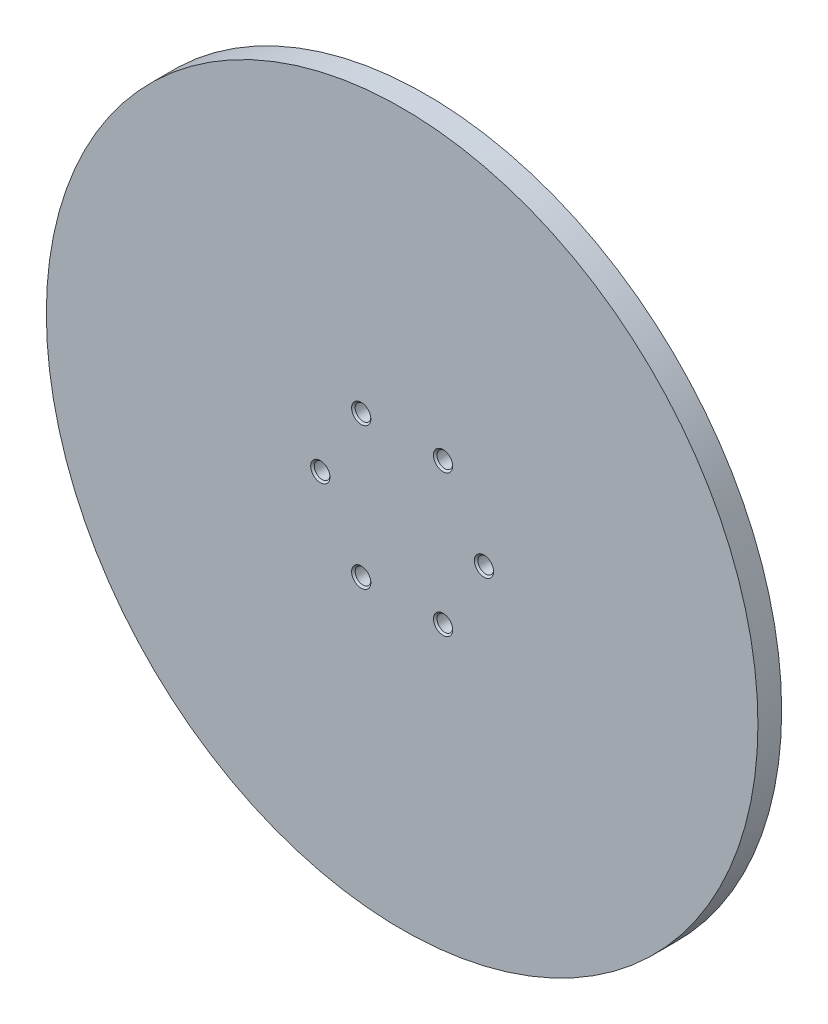
ISO-10303-21;
HEADER;
FILE_DESCRIPTION(('STEP AP214'),'2;1');
FILE_NAME('part.step','',(''),(''),'','','');
FILE_SCHEMA(('AUTOMOTIVE_DESIGN { 1 0 10303 214 1 1 1 1 }'));
ENDSEC;
DATA;
#1=APPLICATION_CONTEXT('core data for automotive mechanical design processes');
#2=APPLICATION_PROTOCOL_DEFINITION('international standard','automotive_design',2000,#1);
#3=PRODUCT_CONTEXT('',#1,'mechanical');
#4=PRODUCT('Part','Part','',(#3));
#5=PRODUCT_RELATED_PRODUCT_CATEGORY('part','',(#4));
#6=PRODUCT_DEFINITION_FORMATION('','',#4);
#7=PRODUCT_DEFINITION_CONTEXT('part definition',#1,'design');
#8=PRODUCT_DEFINITION('design','',#6,#7);
#9=PRODUCT_DEFINITION_SHAPE('','',#8);
#10=(LENGTH_UNIT() NAMED_UNIT(*) SI_UNIT(.MILLI.,.METRE.));
#11=(NAMED_UNIT(*) PLANE_ANGLE_UNIT() SI_UNIT($,.RADIAN.));
#12=(NAMED_UNIT(*) SI_UNIT($,.STERADIAN.) SOLID_ANGLE_UNIT());
#13=UNCERTAINTY_MEASURE_WITH_UNIT(LENGTH_MEASURE(1.E-05),#10,'distance_accuracy_value','');
#14=(GEOMETRIC_REPRESENTATION_CONTEXT(3) GLOBAL_UNCERTAINTY_ASSIGNED_CONTEXT((#13)) GLOBAL_UNIT_ASSIGNED_CONTEXT((#10,
#11,#12)) REPRESENTATION_CONTEXT('',''));
#15=CARTESIAN_POINT('',(0.,0.,0.));
#16=DIRECTION('',(0.,0.,1.));
#17=DIRECTION('',(1.,0.,0.));
#18=AXIS2_PLACEMENT_3D('',#15,#16,#17);
#19=CARTESIAN_POINT('',(-61.8331807739279,36.7015965636658,5.));
#20=DIRECTION('',(0.,0.,1.));
#21=DIRECTION('',(1.,0.,0.));
#22=AXIS2_PLACEMENT_3D('',#19,#20,#21);
#23=PLANE('',#22);
#24=CARTESIAN_POINT('',(-70.4581807739281,51.6405347789473,5.));
#25=DIRECTION('',(0.,0.,1.));
#26=DIRECTION('',(1.,0.,0.));
#27=AXIS2_PLACEMENT_3D('',#24,#25,#26);
#28=CIRCLE('',#27,2.025);
#29=CARTESIAN_POINT('',(-68.4331807739281,51.6405347789473,5.));
#30=VERTEX_POINT('',#29);
#31=EDGE_CURVE('E100',#30,#30,#28,.T.);
#32=ORIENTED_EDGE('',*,*,#31,.F.);
#33=EDGE_LOOP('',(#32));
#34=FACE_BOUND('',#33,.T.);
#35=CARTESIAN_POINT('',(-53.2081807739281,51.6405347789474,5.));
#36=DIRECTION('',(0.,0.,1.));
#37=DIRECTION('',(1.,0.,0.));
#38=AXIS2_PLACEMENT_3D('',#35,#36,#37);
#39=CIRCLE('',#38,2.025);
#40=CARTESIAN_POINT('',(-51.1831807739281,51.6405347789474,5.));
#41=VERTEX_POINT('',#40);
#42=EDGE_CURVE('E91',#41,#41,#39,.T.);
#43=ORIENTED_EDGE('',*,*,#42,.F.);
#44=EDGE_LOOP('',(#43));
#45=FACE_BOUND('',#44,.T.);
#46=CARTESIAN_POINT('',(-44.5831807739279,36.7015965636658,5.));
#47=DIRECTION('',(0.,0.,1.));
#48=DIRECTION('',(1.,0.,0.));
#49=AXIS2_PLACEMENT_3D('',#46,#47,#48);
#50=CIRCLE('',#49,2.025);
#51=CARTESIAN_POINT('',(-42.5581807739279,36.7015965636658,5.));
#52=VERTEX_POINT('',#51);
#53=EDGE_CURVE('E82',#52,#52,#50,.T.);
#54=ORIENTED_EDGE('',*,*,#53,.F.);
#55=EDGE_LOOP('',(#54));
#56=FACE_BOUND('',#55,.T.);
#57=CARTESIAN_POINT('',(-53.2081807739278,21.7626583483843,5.));
#58=DIRECTION('',(0.,0.,1.));
#59=DIRECTION('',(1.,0.,0.));
#60=AXIS2_PLACEMENT_3D('',#57,#58,#59);
#61=CIRCLE('',#60,2.025);
#62=CARTESIAN_POINT('',(-51.1831807739278,21.7626583483843,5.));
#63=VERTEX_POINT('',#62);
#64=EDGE_CURVE('E73',#63,#63,#61,.T.);
#65=ORIENTED_EDGE('',*,*,#64,.F.);
#66=EDGE_LOOP('',(#65));
#67=FACE_BOUND('',#66,.T.);
#68=CARTESIAN_POINT('',(-70.4581807739279,21.7626583483842,5.));
#69=DIRECTION('',(0.,0.,1.));
#70=DIRECTION('',(1.,0.,0.));
#71=AXIS2_PLACEMENT_3D('',#68,#69,#70);
#72=CIRCLE('',#71,2.025);
#73=CARTESIAN_POINT('',(-68.4331807739279,21.7626583483842,5.));
#74=VERTEX_POINT('',#73);
#75=EDGE_CURVE('E64',#74,#74,#72,.T.);
#76=ORIENTED_EDGE('',*,*,#75,.F.);
#77=EDGE_LOOP('',(#76));
#78=FACE_BOUND('',#77,.T.);
#79=CARTESIAN_POINT('',(-79.0831807739279,36.7015965636658,5.));
#80=DIRECTION('',(0.,0.,1.));
#81=DIRECTION('',(1.,0.,0.));
#82=AXIS2_PLACEMENT_3D('',#79,#80,#81);
#83=CIRCLE('',#82,2.025);
#84=CARTESIAN_POINT('',(-77.0581807739279,36.7015965636658,5.));
#85=VERTEX_POINT('',#84);
#86=EDGE_CURVE('E55',#85,#85,#83,.T.);
#87=ORIENTED_EDGE('',*,*,#86,.F.);
#88=EDGE_LOOP('',(#87));
#89=FACE_BOUND('',#88,.T.);
#90=CARTESIAN_POINT('',(-61.8331807739279,36.7015965636658,5.));
#91=DIRECTION('',(0.,0.,1.));
#92=DIRECTION('',(1.,0.,0.));
#93=AXIS2_PLACEMENT_3D('',#90,#91,#92);
#94=CIRCLE('',#93,75.);
#95=CARTESIAN_POINT('',(13.1668192260721,36.7015965636658,5.));
#96=VERTEX_POINT('',#95);
#97=EDGE_CURVE('E10',#96,#96,#94,.T.);
#98=ORIENTED_EDGE('',*,*,#97,.T.);
#99=EDGE_LOOP('',(#98));
#100=FACE_BOUND('',#99,.T.);
#101=ADVANCED_FACE('F37',(#34,#45,#56,#67,#78,#89,#100),#23,.T.);
#102=CARTESIAN_POINT('',(-61.8331807739279,36.7015965636658,0.));
#103=DIRECTION('',(0.,0.,1.));
#104=DIRECTION('',(1.,0.,0.));
#105=AXIS2_PLACEMENT_3D('',#102,#103,#104);
#106=PLANE('',#105);
#107=CARTESIAN_POINT('',(-70.4581807739281,51.6405347789473,0.));
#108=DIRECTION('',(0.,0.,1.));
#109=DIRECTION('',(1.,0.,0.));
#110=AXIS2_PLACEMENT_3D('',#107,#108,#109);
#111=CIRCLE('',#110,1.65);
#112=CARTESIAN_POINT('',(-68.8081807739281,51.6405347789473,0.));
#113=VERTEX_POINT('',#112);
#114=EDGE_CURVE('E94',#113,#113,#111,.T.);
#115=ORIENTED_EDGE('',*,*,#114,.T.);
#116=EDGE_LOOP('',(#115));
#117=FACE_BOUND('',#116,.T.);
#118=CARTESIAN_POINT('',(-53.2081807739281,51.6405347789474,0.));
#119=DIRECTION('',(0.,0.,1.));
#120=DIRECTION('',(1.,0.,0.));
#121=AXIS2_PLACEMENT_3D('',#118,#119,#120);
#122=CIRCLE('',#121,1.65);
#123=CARTESIAN_POINT('',(-51.5581807739281,51.6405347789474,0.));
#124=VERTEX_POINT('',#123);
#125=EDGE_CURVE('E85',#124,#124,#122,.T.);
#126=ORIENTED_EDGE('',*,*,#125,.T.);
#127=EDGE_LOOP('',(#126));
#128=FACE_BOUND('',#127,.T.);
#129=CARTESIAN_POINT('',(-44.5831807739279,36.7015965636658,0.));
#130=DIRECTION('',(0.,0.,1.));
#131=DIRECTION('',(1.,0.,0.));
#132=AXIS2_PLACEMENT_3D('',#129,#130,#131);
#133=CIRCLE('',#132,1.65);
#134=CARTESIAN_POINT('',(-42.9331807739279,36.7015965636658,0.));
#135=VERTEX_POINT('',#134);
#136=EDGE_CURVE('E76',#135,#135,#133,.T.);
#137=ORIENTED_EDGE('',*,*,#136,.T.);
#138=EDGE_LOOP('',(#137));
#139=FACE_BOUND('',#138,.T.);
#140=CARTESIAN_POINT('',(-53.2081807739278,21.7626583483843,0.));
#141=DIRECTION('',(0.,0.,1.));
#142=DIRECTION('',(1.,0.,0.));
#143=AXIS2_PLACEMENT_3D('',#140,#141,#142);
#144=CIRCLE('',#143,1.65);
#145=CARTESIAN_POINT('',(-51.5581807739278,21.7626583483843,0.));
#146=VERTEX_POINT('',#145);
#147=EDGE_CURVE('E67',#146,#146,#144,.T.);
#148=ORIENTED_EDGE('',*,*,#147,.T.);
#149=EDGE_LOOP('',(#148));
#150=FACE_BOUND('',#149,.T.);
#151=CARTESIAN_POINT('',(-70.4581807739279,21.7626583483842,0.));
#152=DIRECTION('',(0.,0.,1.));
#153=DIRECTION('',(1.,0.,0.));
#154=AXIS2_PLACEMENT_3D('',#151,#152,#153);
#155=CIRCLE('',#154,1.65);
#156=CARTESIAN_POINT('',(-68.8081807739279,21.7626583483842,0.));
#157=VERTEX_POINT('',#156);
#158=EDGE_CURVE('E58',#157,#157,#155,.T.);
#159=ORIENTED_EDGE('',*,*,#158,.T.);
#160=EDGE_LOOP('',(#159));
#161=FACE_BOUND('',#160,.T.);
#162=CARTESIAN_POINT('',(-79.0831807739279,36.7015965636658,0.));
#163=DIRECTION('',(0.,0.,1.));
#164=DIRECTION('',(1.,0.,0.));
#165=AXIS2_PLACEMENT_3D('',#162,#163,#164);
#166=CIRCLE('',#165,1.65);
#167=CARTESIAN_POINT('',(-77.4331807739279,36.7015965636658,0.));
#168=VERTEX_POINT('',#167);
#169=EDGE_CURVE('E48',#168,#168,#166,.T.);
#170=ORIENTED_EDGE('',*,*,#169,.T.);
#171=EDGE_LOOP('',(#170));
#172=FACE_BOUND('',#171,.T.);
#173=CARTESIAN_POINT('',(-61.8331807739279,36.7015965636658,0.));
#174=DIRECTION('',(0.,0.,1.));
#175=DIRECTION('',(1.,0.,0.));
#176=AXIS2_PLACEMENT_3D('',#173,#174,#175);
#177=CIRCLE('',#176,75.);
#178=CARTESIAN_POINT('',(13.1668192260721,36.7015965636658,0.));
#179=VERTEX_POINT('',#178);
#180=EDGE_CURVE('E41',#179,#179,#177,.T.);
#181=ORIENTED_EDGE('',*,*,#180,.F.);
#182=EDGE_LOOP('',(#181));
#183=FACE_BOUND('',#182,.T.);
#184=ADVANCED_FACE('F108',(#117,#128,#139,#150,#161,#172,#183),#106,.F.);
#185=CARTESIAN_POINT('',(-61.8331807739279,36.7015965636658,5.));
#186=DIRECTION('',(0.,0.,-1.));
#187=DIRECTION('',(-1.,0.,0.));
#188=AXIS2_PLACEMENT_3D('',#185,#186,#187);
#189=CYLINDRICAL_SURFACE('',#188,75.);
#190=ORIENTED_EDGE('',*,*,#97,.F.);
#191=EDGE_LOOP('',(#190));
#192=FACE_BOUND('',#191,.T.);
#193=ORIENTED_EDGE('',*,*,#180,.T.);
#194=EDGE_LOOP('',(#193));
#195=FACE_BOUND('',#194,.T.);
#196=ADVANCED_FACE('F39',(#192,#195),#189,.T.);
#197=CARTESIAN_POINT('',(-79.0831807739279,36.7015965636658,5.));
#198=DIRECTION('',(0.,0.,1.));
#199=DIRECTION('',(1.,0.,0.));
#200=AXIS2_PLACEMENT_3D('',#197,#198,#199);
#201=CYLINDRICAL_SURFACE('',#200,1.65);
#202=ORIENTED_EDGE('',*,*,#169,.F.);
#203=EDGE_LOOP('',(#202));
#204=FACE_BOUND('',#203,.T.);
#205=CARTESIAN_POINT('',(-79.0831807739279,36.7015965636658,4.625));
#206=DIRECTION('',(0.,0.,1.));
#207=DIRECTION('',(1.,0.,0.));
#208=AXIS2_PLACEMENT_3D('',#205,#206,#207);
#209=CIRCLE('',#208,1.65);
#210=CARTESIAN_POINT('',(-77.4331807739279,36.7015965636658,4.625));
#211=VERTEX_POINT('',#210);
#212=EDGE_CURVE('E52',#211,#211,#209,.T.);
#213=ORIENTED_EDGE('',*,*,#212,.T.);
#214=EDGE_LOOP('',(#213));
#215=FACE_BOUND('',#214,.T.);
#216=ADVANCED_FACE('F123',(#204,#215),#201,.F.);
#217=CARTESIAN_POINT('',(-79.0831807739279,36.7015965636658,5.));
#218=DIRECTION('',(0.,0.,1.));
#219=DIRECTION('',(1.,0.,0.));
#220=AXIS2_PLACEMENT_3D('',#217,#218,#219);
#221=CONICAL_SURFACE('',#220,2.025,0.785398163397446);
#222=ORIENTED_EDGE('',*,*,#212,.F.);
#223=EDGE_LOOP('',(#222));
#224=FACE_BOUND('',#223,.T.);
#225=ORIENTED_EDGE('',*,*,#86,.T.);
#226=EDGE_LOOP('',(#225));
#227=FACE_BOUND('',#226,.T.);
#228=ADVANCED_FACE('F120',(#224,#227),#221,.F.);
#229=CARTESIAN_POINT('',(-70.4581807739279,21.7626583483842,5.));
#230=DIRECTION('',(0.,0.,1.));
#231=DIRECTION('',(1.,0.,0.));
#232=AXIS2_PLACEMENT_3D('',#229,#230,#231);
#233=CYLINDRICAL_SURFACE('',#232,1.65);
#234=ORIENTED_EDGE('',*,*,#158,.F.);
#235=EDGE_LOOP('',(#234));
#236=FACE_BOUND('',#235,.T.);
#237=CARTESIAN_POINT('',(-70.4581807739279,21.7626583483842,4.625));
#238=DIRECTION('',(0.,0.,1.));
#239=DIRECTION('',(1.,0.,0.));
#240=AXIS2_PLACEMENT_3D('',#237,#238,#239);
#241=CIRCLE('',#240,1.65);
#242=CARTESIAN_POINT('',(-68.8081807739279,21.7626583483842,4.625));
#243=VERTEX_POINT('',#242);
#244=EDGE_CURVE('E61',#243,#243,#241,.T.);
#245=ORIENTED_EDGE('',*,*,#244,.T.);
#246=EDGE_LOOP('',(#245));
#247=FACE_BOUND('',#246,.T.);
#248=ADVANCED_FACE('F122',(#236,#247),#233,.F.);
#249=CARTESIAN_POINT('',(-70.4581807739279,21.7626583483842,5.));
#250=DIRECTION('',(0.,0.,1.));
#251=DIRECTION('',(1.,0.,0.));
#252=AXIS2_PLACEMENT_3D('',#249,#250,#251);
#253=CONICAL_SURFACE('',#252,2.025,0.785398163397446);
#254=ORIENTED_EDGE('',*,*,#244,.F.);
#255=EDGE_LOOP('',(#254));
#256=FACE_BOUND('',#255,.T.);
#257=ORIENTED_EDGE('',*,*,#75,.T.);
#258=EDGE_LOOP('',(#257));
#259=FACE_BOUND('',#258,.T.);
#260=ADVANCED_FACE('F130',(#256,#259),#253,.F.);
#261=CARTESIAN_POINT('',(-53.2081807739278,21.7626583483843,5.));
#262=DIRECTION('',(0.,0.,1.));
#263=DIRECTION('',(1.,0.,0.));
#264=AXIS2_PLACEMENT_3D('',#261,#262,#263);
#265=CYLINDRICAL_SURFACE('',#264,1.65);
#266=ORIENTED_EDGE('',*,*,#147,.F.);
#267=EDGE_LOOP('',(#266));
#268=FACE_BOUND('',#267,.T.);
#269=CARTESIAN_POINT('',(-53.2081807739278,21.7626583483843,4.625));
#270=DIRECTION('',(0.,0.,1.));
#271=DIRECTION('',(1.,0.,0.));
#272=AXIS2_PLACEMENT_3D('',#269,#270,#271);
#273=CIRCLE('',#272,1.65);
#274=CARTESIAN_POINT('',(-51.5581807739278,21.7626583483843,4.625));
#275=VERTEX_POINT('',#274);
#276=EDGE_CURVE('E70',#275,#275,#273,.T.);
#277=ORIENTED_EDGE('',*,*,#276,.T.);
#278=EDGE_LOOP('',(#277));
#279=FACE_BOUND('',#278,.T.);
#280=ADVANCED_FACE('F163',(#268,#279),#265,.F.);
#281=CARTESIAN_POINT('',(-53.2081807739278,21.7626583483843,5.));
#282=DIRECTION('',(0.,0.,1.));
#283=DIRECTION('',(1.,0.,0.));
#284=AXIS2_PLACEMENT_3D('',#281,#282,#283);
#285=CONICAL_SURFACE('',#284,2.025,0.785398163397446);
#286=ORIENTED_EDGE('',*,*,#276,.F.);
#287=EDGE_LOOP('',(#286));
#288=FACE_BOUND('',#287,.T.);
#289=ORIENTED_EDGE('',*,*,#64,.T.);
#290=EDGE_LOOP('',(#289));
#291=FACE_BOUND('',#290,.T.);
#292=ADVANCED_FACE('F167',(#288,#291),#285,.F.);
#293=CARTESIAN_POINT('',(-44.5831807739279,36.7015965636658,5.));
#294=DIRECTION('',(0.,0.,1.));
#295=DIRECTION('',(1.,0.,0.));
#296=AXIS2_PLACEMENT_3D('',#293,#294,#295);
#297=CYLINDRICAL_SURFACE('',#296,1.65);
#298=ORIENTED_EDGE('',*,*,#136,.F.);
#299=EDGE_LOOP('',(#298));
#300=FACE_BOUND('',#299,.T.);
#301=CARTESIAN_POINT('',(-44.5831807739279,36.7015965636658,4.625));
#302=DIRECTION('',(0.,0.,1.));
#303=DIRECTION('',(1.,0.,0.));
#304=AXIS2_PLACEMENT_3D('',#301,#302,#303);
#305=CIRCLE('',#304,1.65);
#306=CARTESIAN_POINT('',(-42.9331807739279,36.7015965636658,4.625));
#307=VERTEX_POINT('',#306);
#308=EDGE_CURVE('E79',#307,#307,#305,.T.);
#309=ORIENTED_EDGE('',*,*,#308,.T.);
#310=EDGE_LOOP('',(#309));
#311=FACE_BOUND('',#310,.T.);
#312=ADVANCED_FACE('F173',(#300,#311),#297,.F.);
#313=CARTESIAN_POINT('',(-44.5831807739279,36.7015965636658,5.));
#314=DIRECTION('',(0.,0.,1.));
#315=DIRECTION('',(1.,0.,0.));
#316=AXIS2_PLACEMENT_3D('',#313,#314,#315);
#317=CONICAL_SURFACE('',#316,2.025,0.785398163397446);
#318=ORIENTED_EDGE('',*,*,#308,.F.);
#319=EDGE_LOOP('',(#318));
#320=FACE_BOUND('',#319,.T.);
#321=ORIENTED_EDGE('',*,*,#53,.T.);
#322=EDGE_LOOP('',(#321));
#323=FACE_BOUND('',#322,.T.);
#324=ADVANCED_FACE('F177',(#320,#323),#317,.F.);
#325=CARTESIAN_POINT('',(-53.2081807739281,51.6405347789474,5.));
#326=DIRECTION('',(0.,0.,1.));
#327=DIRECTION('',(1.,0.,0.));
#328=AXIS2_PLACEMENT_3D('',#325,#326,#327);
#329=CYLINDRICAL_SURFACE('',#328,1.65);
#330=ORIENTED_EDGE('',*,*,#125,.F.);
#331=EDGE_LOOP('',(#330));
#332=FACE_BOUND('',#331,.T.);
#333=CARTESIAN_POINT('',(-53.2081807739281,51.6405347789474,4.625));
#334=DIRECTION('',(0.,0.,1.));
#335=DIRECTION('',(1.,0.,0.));
#336=AXIS2_PLACEMENT_3D('',#333,#334,#335);
#337=CIRCLE('',#336,1.65);
#338=CARTESIAN_POINT('',(-51.5581807739281,51.6405347789474,4.625));
#339=VERTEX_POINT('',#338);
#340=EDGE_CURVE('E88',#339,#339,#337,.T.);
#341=ORIENTED_EDGE('',*,*,#340,.T.);
#342=EDGE_LOOP('',(#341));
#343=FACE_BOUND('',#342,.T.);
#344=ADVANCED_FACE('F181',(#332,#343),#329,.F.);
#345=CARTESIAN_POINT('',(-53.2081807739281,51.6405347789474,5.));
#346=DIRECTION('',(0.,0.,1.));
#347=DIRECTION('',(1.,0.,0.));
#348=AXIS2_PLACEMENT_3D('',#345,#346,#347);
#349=CONICAL_SURFACE('',#348,2.025,0.785398163397446);
#350=ORIENTED_EDGE('',*,*,#340,.F.);
#351=EDGE_LOOP('',(#350));
#352=FACE_BOUND('',#351,.T.);
#353=ORIENTED_EDGE('',*,*,#42,.T.);
#354=EDGE_LOOP('',(#353));
#355=FACE_BOUND('',#354,.T.);
#356=ADVANCED_FACE('F185',(#352,#355),#349,.F.);
#357=CARTESIAN_POINT('',(-70.4581807739281,51.6405347789473,5.));
#358=DIRECTION('',(0.,0.,1.));
#359=DIRECTION('',(1.,0.,0.));
#360=AXIS2_PLACEMENT_3D('',#357,#358,#359);
#361=CYLINDRICAL_SURFACE('',#360,1.65);
#362=ORIENTED_EDGE('',*,*,#114,.F.);
#363=EDGE_LOOP('',(#362));
#364=FACE_BOUND('',#363,.T.);
#365=CARTESIAN_POINT('',(-70.4581807739281,51.6405347789473,4.625));
#366=DIRECTION('',(0.,0.,1.));
#367=DIRECTION('',(1.,0.,0.));
#368=AXIS2_PLACEMENT_3D('',#365,#366,#367);
#369=CIRCLE('',#368,1.65);
#370=CARTESIAN_POINT('',(-68.8081807739281,51.6405347789473,4.625));
#371=VERTEX_POINT('',#370);
#372=EDGE_CURVE('E97',#371,#371,#369,.T.);
#373=ORIENTED_EDGE('',*,*,#372,.T.);
#374=EDGE_LOOP('',(#373));
#375=FACE_BOUND('',#374,.T.);
#376=ADVANCED_FACE('F189',(#364,#375),#361,.F.);
#377=CARTESIAN_POINT('',(-70.4581807739281,51.6405347789473,5.));
#378=DIRECTION('',(0.,0.,1.));
#379=DIRECTION('',(1.,0.,0.));
#380=AXIS2_PLACEMENT_3D('',#377,#378,#379);
#381=CONICAL_SURFACE('',#380,2.025,0.785398163397446);
#382=ORIENTED_EDGE('',*,*,#372,.F.);
#383=EDGE_LOOP('',(#382));
#384=FACE_BOUND('',#383,.T.);
#385=ORIENTED_EDGE('',*,*,#31,.T.);
#386=EDGE_LOOP('',(#385));
#387=FACE_BOUND('',#386,.T.);
#388=ADVANCED_FACE('F104',(#384,#387),#381,.F.);
#389=CLOSED_SHELL('',(#101,#184,#196,#216,#228,#248,#260,#280,#292,#312,#324,#344,#356,#376,#388));
#390=MANIFOLD_SOLID_BREP('B2',#389);
#391=ADVANCED_BREP_SHAPE_REPRESENTATION('',(#18,#390),#14);
#392=SHAPE_DEFINITION_REPRESENTATION(#9,#391);
ENDSEC;
END-ISO-10303-21;
